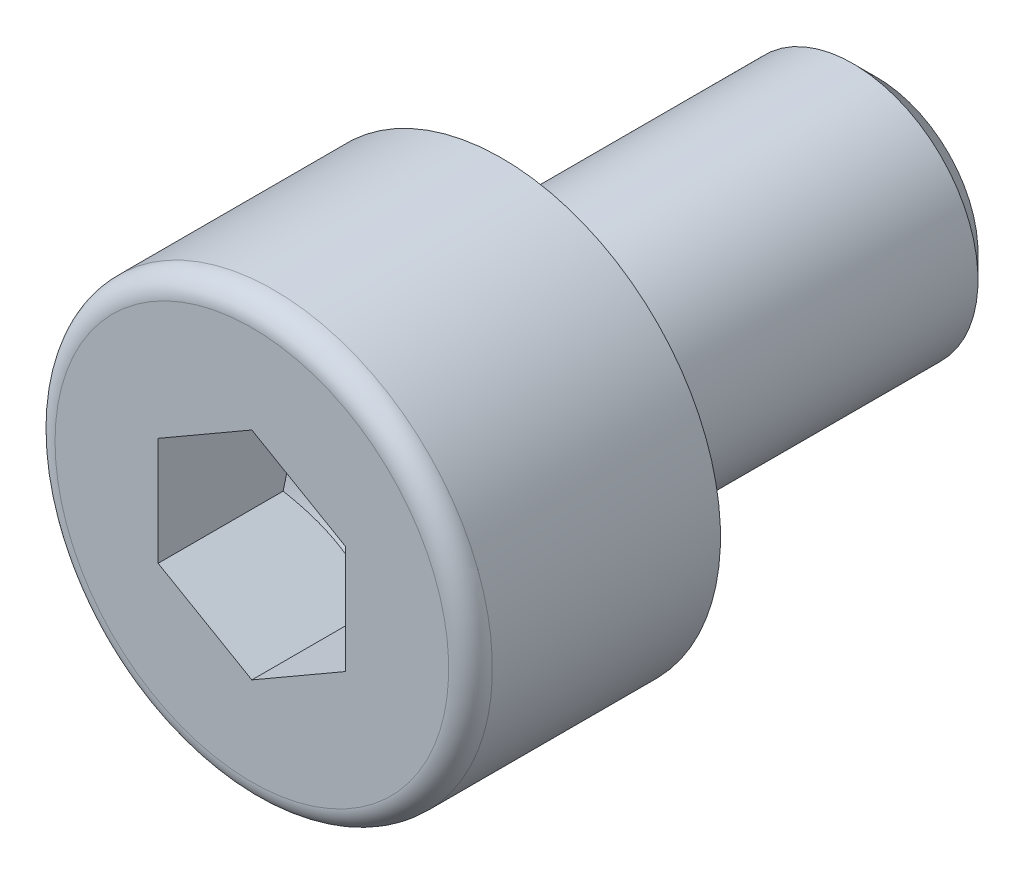
ISO-10303-21;
HEADER;
FILE_DESCRIPTION(('STEP AP214'),'2;1');
FILE_NAME('part.step','',(''),(''),'','','');
FILE_SCHEMA(('AUTOMOTIVE_DESIGN { 1 0 10303 214 1 1 1 1 }'));
ENDSEC;
DATA;
#1=APPLICATION_CONTEXT('core data for automotive mechanical design processes');
#2=APPLICATION_PROTOCOL_DEFINITION('international standard','automotive_design',2000,#1);
#3=PRODUCT_CONTEXT('',#1,'mechanical');
#4=PRODUCT('Part','Part','',(#3));
#5=PRODUCT_RELATED_PRODUCT_CATEGORY('part','',(#4));
#6=PRODUCT_DEFINITION_FORMATION('','',#4);
#7=PRODUCT_DEFINITION_CONTEXT('part definition',#1,'design');
#8=PRODUCT_DEFINITION('design','',#6,#7);
#9=PRODUCT_DEFINITION_SHAPE('','',#8);
#10=(LENGTH_UNIT() NAMED_UNIT(*) SI_UNIT(.MILLI.,.METRE.));
#11=(NAMED_UNIT(*) PLANE_ANGLE_UNIT() SI_UNIT($,.RADIAN.));
#12=(NAMED_UNIT(*) SI_UNIT($,.STERADIAN.) SOLID_ANGLE_UNIT());
#13=UNCERTAINTY_MEASURE_WITH_UNIT(LENGTH_MEASURE(1.E-05),#10,'distance_accuracy_value','');
#14=(GEOMETRIC_REPRESENTATION_CONTEXT(3) GLOBAL_UNCERTAINTY_ASSIGNED_CONTEXT((#13)) GLOBAL_UNIT_ASSIGNED_CONTEXT((#10,
#11,#12)) REPRESENTATION_CONTEXT('',''));
#15=CARTESIAN_POINT('',(0.,0.,0.));
#16=DIRECTION('',(0.,0.,1.));
#17=DIRECTION('',(1.,0.,0.));
#18=AXIS2_PLACEMENT_3D('',#15,#16,#17);
#19=CARTESIAN_POINT('',(-1.75,0.,0.));
#20=DIRECTION('',(0.,0.,-1.));
#21=DIRECTION('',(-1.,0.,0.));
#22=AXIS2_PLACEMENT_3D('',#19,#20,#21);
#23=PLANE('',#22);
#24=CARTESIAN_POINT('',(0.,0.,0.));
#25=DIRECTION('',(0.,0.,-1.));
#26=DIRECTION('',(-1.,0.,0.));
#27=AXIS2_PLACEMENT_3D('',#24,#25,#26);
#28=CIRCLE('',#27,3.5);
#29=CARTESIAN_POINT('',(-3.5,0.,0.));
#30=VERTEX_POINT('',#29);
#31=EDGE_CURVE('E11',#30,#30,#28,.T.);
#32=ORIENTED_EDGE('',*,*,#31,.T.);
#33=EDGE_LOOP('',(#32));
#34=FACE_BOUND('',#33,.T.);
#35=CARTESIAN_POINT('',(0.,0.,0.));
#36=DIRECTION('',(0.,0.,1.));
#37=DIRECTION('',(-1.,0.,0.));
#38=AXIS2_PLACEMENT_3D('',#35,#36,#37);
#39=CIRCLE('',#38,2.);
#40=CARTESIAN_POINT('',(2.,0.,0.));
#41=VERTEX_POINT('',#40);
#42=EDGE_CURVE('E67',#41,#41,#39,.T.);
#43=ORIENTED_EDGE('',*,*,#42,.T.);
#44=EDGE_LOOP('',(#43));
#45=FACE_BOUND('',#44,.T.);
#46=ADVANCED_FACE('F16',(#34,#45),#23,.T.);
#47=CARTESIAN_POINT('',(0.,0.,1.825));
#48=DIRECTION('',(0.,0.,1.));
#49=DIRECTION('',(-1.,0.,0.));
#50=AXIS2_PLACEMENT_3D('',#47,#48,#49);
#51=CYLINDRICAL_SURFACE('',#50,3.5);
#52=CARTESIAN_POINT('',(0.,0.,3.65));
#53=DIRECTION('',(0.,0.,-1.));
#54=DIRECTION('',(-1.,0.,0.));
#55=AXIS2_PLACEMENT_3D('',#52,#53,#54);
#56=CIRCLE('',#55,3.5);
#57=CARTESIAN_POINT('',(-3.5,0.,3.65));
#58=VERTEX_POINT('',#57);
#59=EDGE_CURVE('E26',#58,#58,#56,.T.);
#60=ORIENTED_EDGE('',*,*,#59,.T.);
#61=EDGE_LOOP('',(#60));
#62=FACE_BOUND('',#61,.T.);
#63=ORIENTED_EDGE('',*,*,#31,.F.);
#64=EDGE_LOOP('',(#63));
#65=FACE_BOUND('',#64,.T.);
#66=ADVANCED_FACE('F206',(#62,#65),#51,.T.);
#67=CARTESIAN_POINT('',(0.,0.,3.65));
#68=DIRECTION('',(0.,0.,-1.));
#69=DIRECTION('',(0.,-1.,0.));
#70=AXIS2_PLACEMENT_3D('',#67,#68,#69);
#71=TOROIDAL_SURFACE('',#70,3.15,0.35);
#72=CARTESIAN_POINT('',(0.,0.,4.));
#73=DIRECTION('',(0.,0.,-1.));
#74=DIRECTION('',(-1.,0.,0.));
#75=AXIS2_PLACEMENT_3D('',#72,#73,#74);
#76=CIRCLE('',#75,3.15);
#77=CARTESIAN_POINT('',(-3.15,0.,4.));
#78=VERTEX_POINT('',#77);
#79=EDGE_CURVE('E124',#78,#78,#76,.T.);
#80=ORIENTED_EDGE('',*,*,#79,.T.);
#81=EDGE_LOOP('',(#80));
#82=FACE_BOUND('',#81,.T.);
#83=ORIENTED_EDGE('',*,*,#59,.F.);
#84=EDGE_LOOP('',(#83));
#85=FACE_BOUND('',#84,.T.);
#86=ADVANCED_FACE('F210',(#82,#85),#71,.T.);
#87=CARTESIAN_POINT('',(-1.575,0.,4.));
#88=DIRECTION('',(0.,0.,1.));
#89=DIRECTION('',(1.,0.,0.));
#90=AXIS2_PLACEMENT_3D('',#87,#88,#89);
#91=PLANE('',#90);
#92=ORIENTED_EDGE('',*,*,#79,.F.);
#93=EDGE_LOOP('',(#92));
#94=FACE_BOUND('',#93,.T.);
#95=DIRECTION('',(-0.866025403784439,-0.5,0.));
#96=VECTOR('',#95,1.);
#97=CARTESIAN_POINT('',(0.159374650312418,-1.64003500274012,4.));
#98=LINE('',#97,#96);
#99=CARTESIAN_POINT('',(1.49999930062484,-0.866025,4.));
#100=VERTEX_POINT('',#99);
#101=CARTESIAN_POINT('',(0.,-1.73205,4.));
#102=VERTEX_POINT('',#101);
#103=EDGE_CURVE('E91',#100,#102,#98,.T.);
#104=ORIENTED_EDGE('',*,*,#103,.T.);
#105=DIRECTION('',(-0.866025403784439,0.5,0.));
#106=VECTOR('',#105,1.);
#107=CARTESIAN_POINT('',(-1.34062465031242,-0.958039997259878,4.));
#108=LINE('',#107,#106);
#109=CARTESIAN_POINT('',(-1.49999930062484,-0.866025,4.));
#110=VERTEX_POINT('',#109);
#111=EDGE_CURVE('E87',#102,#110,#108,.T.);
#112=ORIENTED_EDGE('',*,*,#111,.T.);
#113=DIRECTION('',(0.,1.,0.));
#114=VECTOR('',#113,1.);
#115=CARTESIAN_POINT('',(-1.49999930062484,0.,4.));
#116=LINE('',#115,#114);
#117=CARTESIAN_POINT('',(-1.49999930062484,0.866025,4.));
#118=VERTEX_POINT('',#117);
#119=EDGE_CURVE('E121',#110,#118,#116,.T.);
#120=ORIENTED_EDGE('',*,*,#119,.T.);
#121=DIRECTION('',(0.866025403784439,0.5,0.));
#122=VECTOR('',#121,1.);
#123=CARTESIAN_POINT('',(-1.34062465031242,0.958039997259878,4.));
#124=LINE('',#123,#122);
#125=CARTESIAN_POINT('',(0.,1.73205,4.));
#126=VERTEX_POINT('',#125);
#127=EDGE_CURVE('E122',#118,#126,#124,.T.);
#128=ORIENTED_EDGE('',*,*,#127,.T.);
#129=DIRECTION('',(0.866025403784439,-0.5,0.));
#130=VECTOR('',#129,1.);
#131=CARTESIAN_POINT('',(0.159374650312419,1.64003500274012,4.));
#132=LINE('',#131,#130);
#133=CARTESIAN_POINT('',(1.49999930062484,0.866025,4.));
#134=VERTEX_POINT('',#133);
#135=EDGE_CURVE('E136',#126,#134,#132,.T.);
#136=ORIENTED_EDGE('',*,*,#135,.T.);
#137=DIRECTION('',(0.,-1.,0.));
#138=VECTOR('',#137,1.);
#139=CARTESIAN_POINT('',(1.49999930062484,0.,4.));
#140=LINE('',#139,#138);
#141=EDGE_CURVE('E114',#134,#100,#140,.T.);
#142=ORIENTED_EDGE('',*,*,#141,.T.);
#143=EDGE_LOOP('',(#104,#112,#120,#128,#136,#142));
#144=FACE_BOUND('',#143,.T.);
#145=ADVANCED_FACE('F176',(#94,#144),#91,.T.);
#146=CARTESIAN_POINT('',(-0.8105625,0.,-6.));
#147=DIRECTION('',(0.,0.,-1.));
#148=DIRECTION('',(-1.,0.,0.));
#149=AXIS2_PLACEMENT_3D('',#146,#147,#148);
#150=PLANE('',#149);
#151=CARTESIAN_POINT('',(0.,0.,-6.));
#152=DIRECTION('',(0.,0.,-1.));
#153=DIRECTION('',(-1.,0.,0.));
#154=AXIS2_PLACEMENT_3D('',#151,#152,#153);
#155=CIRCLE('',#154,1.621125);
#156=CARTESIAN_POINT('',(-1.621125,0.,-6.));
#157=VERTEX_POINT('',#156);
#158=EDGE_CURVE('E59',#157,#157,#155,.T.);
#159=ORIENTED_EDGE('',*,*,#158,.T.);
#160=EDGE_LOOP('',(#159));
#161=FACE_BOUND('',#160,.T.);
#162=ADVANCED_FACE('F223',(#161),#150,.T.);
#163=CARTESIAN_POINT('',(0.,0.,-5.8105625));
#164=DIRECTION('',(0.,0.,1.));
#165=DIRECTION('',(-1.,0.,0.));
#166=AXIS2_PLACEMENT_3D('',#163,#164,#165);
#167=CONICAL_SURFACE('',#166,1.8105625,0.785398163397448);
#168=CARTESIAN_POINT('',(0.,0.,-5.621125));
#169=DIRECTION('',(0.,0.,-1.));
#170=DIRECTION('',(-1.,0.,0.));
#171=AXIS2_PLACEMENT_3D('',#168,#169,#170);
#172=CIRCLE('',#171,2.);
#173=CARTESIAN_POINT('',(-2.,0.,-5.621125));
#174=VERTEX_POINT('',#173);
#175=EDGE_CURVE('E131',#174,#174,#172,.T.);
#176=ORIENTED_EDGE('',*,*,#175,.T.);
#177=EDGE_LOOP('',(#176));
#178=FACE_BOUND('',#177,.T.);
#179=ORIENTED_EDGE('',*,*,#158,.F.);
#180=EDGE_LOOP('',(#179));
#181=FACE_BOUND('',#180,.T.);
#182=ADVANCED_FACE('F228',(#178,#181),#167,.T.);
#183=CARTESIAN_POINT('',(0.,0.,-2.3105625));
#184=DIRECTION('',(0.,0.,1.));
#185=DIRECTION('',(-1.,0.,0.));
#186=AXIS2_PLACEMENT_3D('',#183,#184,#185);
#187=CYLINDRICAL_SURFACE('',#186,2.);
#188=ORIENTED_EDGE('',*,*,#42,.F.);
#189=EDGE_LOOP('',(#188));
#190=FACE_BOUND('',#189,.T.);
#191=ORIENTED_EDGE('',*,*,#175,.F.);
#192=EDGE_LOOP('',(#191));
#193=FACE_BOUND('',#192,.T.);
#194=ADVANCED_FACE('F237',(#190,#193),#187,.T.);
#195=CARTESIAN_POINT('',(-0.749999650312418,-1.2990375,4.));
#196=DIRECTION('',(-0.5,-0.866025403784439,0.));
#197=DIRECTION('',(-0.866025403784439,0.5,0.));
#198=AXIS2_PLACEMENT_3D('',#195,#196,#197);
#199=PLANE('',#198);
#200=CARTESIAN_POINT('',(0.,-1.73205,2.));
#201=CARTESIAN_POINT('',(-0.749999650312417,-1.2990375,1.75000011656253));
#202=CARTESIAN_POINT('',(-1.49999930062484,-0.866025,2.));
#203=(BOUNDED_CURVE() B_SPLINE_CURVE(2,(#200,#201,#202),.UNSPECIFIED.,.F.,
.F.) B_SPLINE_CURVE_WITH_KNOTS((3,3),(0.,1.75265338994166),
.UNSPECIFIED.) CURVE() GEOMETRIC_REPRESENTATION_ITEM() RATIONAL_B_SPLINE_CURVE((1.,
1.15470053837925,1.)) REPRESENTATION_ITEM(''));
#204=CARTESIAN_POINT('',(0.,-1.73205,2.));
#205=VERTEX_POINT('',#204);
#206=CARTESIAN_POINT('',(-1.49999930062484,-0.866025,2.));
#207=VERTEX_POINT('',#206);
#208=EDGE_CURVE('E84',#205,#207,#203,.T.);
#209=ORIENTED_EDGE('',*,*,#208,.T.);
#210=DIRECTION('',(0.,0.,-1.));
#211=VECTOR('',#210,1.);
#212=CARTESIAN_POINT('',(-1.49999930062484,-0.866025,4.));
#213=LINE('',#212,#211);
#214=EDGE_CURVE('E127',#110,#207,#213,.T.);
#215=ORIENTED_EDGE('',*,*,#214,.F.);
#216=ORIENTED_EDGE('',*,*,#111,.F.);
#217=DIRECTION('',(0.,0.,-1.));
#218=VECTOR('',#217,1.);
#219=CARTESIAN_POINT('',(0.,-1.73205,4.));
#220=LINE('',#219,#218);
#221=EDGE_CURVE('E20',#102,#205,#220,.T.);
#222=ORIENTED_EDGE('',*,*,#221,.T.);
#223=EDGE_LOOP('',(#209,#215,#216,#222));
#224=FACE_BOUND('',#223,.T.);
#225=ADVANCED_FACE('F81',(#224),#199,.F.);
#226=CARTESIAN_POINT('',(-1.49999930062484,0.,4.));
#227=DIRECTION('',(-1.,0.,0.));
#228=DIRECTION('',(0.,1.,0.));
#229=AXIS2_PLACEMENT_3D('',#226,#227,#228);
#230=PLANE('',#229);
#231=CARTESIAN_POINT('',(-1.49999930062484,-0.866025,2.));
#232=CARTESIAN_POINT('',(-1.49999930062483,0.,1.75000011656253));
#233=CARTESIAN_POINT('',(-1.49999930062484,0.866025,2.));
#234=(BOUNDED_CURVE() B_SPLINE_CURVE(2,(#231,#232,#233),.UNSPECIFIED.,.F.,
.F.) B_SPLINE_CURVE_WITH_KNOTS((3,3),(0.,1.75265338994166),
.UNSPECIFIED.) CURVE() GEOMETRIC_REPRESENTATION_ITEM() RATIONAL_B_SPLINE_CURVE((1.,
1.15470053837925,1.)) REPRESENTATION_ITEM(''));
#235=CARTESIAN_POINT('',(-1.49999930062484,0.866025,2.));
#236=VERTEX_POINT('',#235);
#237=EDGE_CURVE('E106',#207,#236,#234,.T.);
#238=ORIENTED_EDGE('',*,*,#237,.T.);
#239=DIRECTION('',(0.,0.,-1.));
#240=VECTOR('',#239,1.);
#241=CARTESIAN_POINT('',(-1.49999930062484,0.866025,4.));
#242=LINE('',#241,#240);
#243=EDGE_CURVE('E119',#118,#236,#242,.T.);
#244=ORIENTED_EDGE('',*,*,#243,.F.);
#245=ORIENTED_EDGE('',*,*,#119,.F.);
#246=ORIENTED_EDGE('',*,*,#214,.T.);
#247=EDGE_LOOP('',(#238,#244,#245,#246));
#248=FACE_BOUND('',#247,.T.);
#249=ADVANCED_FACE('F217',(#248),#230,.F.);
#250=CARTESIAN_POINT('',(-0.749999650312418,1.2990375,4.));
#251=DIRECTION('',(-0.5,0.866025403784439,0.));
#252=DIRECTION('',(0.866025403784439,0.5,0.));
#253=AXIS2_PLACEMENT_3D('',#250,#251,#252);
#254=PLANE('',#253);
#255=CARTESIAN_POINT('',(-1.49999930062484,0.866025,2.));
#256=CARTESIAN_POINT('',(-0.749999650312418,1.2990375,1.75000011656253));
#257=CARTESIAN_POINT('',(0.,1.73205,2.));
#258=(BOUNDED_CURVE() B_SPLINE_CURVE(2,(#255,#256,#257),.UNSPECIFIED.,.F.,
.F.) B_SPLINE_CURVE_WITH_KNOTS((3,3),(0.,1.75265338994166),
.UNSPECIFIED.) CURVE() GEOMETRIC_REPRESENTATION_ITEM() RATIONAL_B_SPLINE_CURVE((1.,
1.15470053837925,1.)) REPRESENTATION_ITEM(''));
#259=CARTESIAN_POINT('',(0.,1.73205,2.));
#260=VERTEX_POINT('',#259);
#261=EDGE_CURVE('E108',#236,#260,#258,.T.);
#262=ORIENTED_EDGE('',*,*,#261,.T.);
#263=DIRECTION('',(0.,0.,-1.));
#264=VECTOR('',#263,1.);
#265=CARTESIAN_POINT('',(0.,1.73205,4.));
#266=LINE('',#265,#264);
#267=EDGE_CURVE('E139',#126,#260,#266,.T.);
#268=ORIENTED_EDGE('',*,*,#267,.F.);
#269=ORIENTED_EDGE('',*,*,#127,.F.);
#270=ORIENTED_EDGE('',*,*,#243,.T.);
#271=EDGE_LOOP('',(#262,#268,#269,#270));
#272=FACE_BOUND('',#271,.T.);
#273=ADVANCED_FACE('F185',(#272),#254,.F.);
#274=CARTESIAN_POINT('',(0.749999650312419,1.2990375,4.));
#275=DIRECTION('',(0.5,0.866025403784439,0.));
#276=DIRECTION('',(0.866025403784439,-0.5,0.));
#277=AXIS2_PLACEMENT_3D('',#274,#275,#276);
#278=PLANE('',#277);
#279=CARTESIAN_POINT('',(0.,1.73205,2.));
#280=CARTESIAN_POINT('',(0.749999650312419,1.2990375,1.75000011656253));
#281=CARTESIAN_POINT('',(1.49999930062484,0.866025,2.));
#282=(BOUNDED_CURVE() B_SPLINE_CURVE(2,(#279,#280,#281),.UNSPECIFIED.,.F.,
.F.) B_SPLINE_CURVE_WITH_KNOTS((3,3),(0.,1.75265338994166),
.UNSPECIFIED.) CURVE() GEOMETRIC_REPRESENTATION_ITEM() RATIONAL_B_SPLINE_CURVE((1.,
1.15470053837925,1.)) REPRESENTATION_ITEM(''));
#283=CARTESIAN_POINT('',(1.49999930062484,0.866025,2.));
#284=VERTEX_POINT('',#283);
#285=EDGE_CURVE('E92',#260,#284,#282,.T.);
#286=ORIENTED_EDGE('',*,*,#285,.T.);
#287=DIRECTION('',(0.,0.,-1.));
#288=VECTOR('',#287,1.);
#289=CARTESIAN_POINT('',(1.49999930062484,0.866025,4.));
#290=LINE('',#289,#288);
#291=EDGE_CURVE('E140',#134,#284,#290,.T.);
#292=ORIENTED_EDGE('',*,*,#291,.F.);
#293=ORIENTED_EDGE('',*,*,#135,.F.);
#294=ORIENTED_EDGE('',*,*,#267,.T.);
#295=EDGE_LOOP('',(#286,#292,#293,#294));
#296=FACE_BOUND('',#295,.T.);
#297=ADVANCED_FACE('F18',(#296),#278,.F.);
#298=CARTESIAN_POINT('',(1.49999930062484,0.,4.));
#299=DIRECTION('',(1.,0.,0.));
#300=DIRECTION('',(0.,-1.,0.));
#301=AXIS2_PLACEMENT_3D('',#298,#299,#300);
#302=PLANE('',#301);
#303=CARTESIAN_POINT('',(1.49999930062484,0.866025,2.));
#304=CARTESIAN_POINT('',(1.49999930062485,0.,1.75000011656253));
#305=CARTESIAN_POINT('',(1.49999930062484,-0.866025,2.));
#306=(BOUNDED_CURVE() B_SPLINE_CURVE(2,(#303,#304,#305),.UNSPECIFIED.,.F.,
.F.) B_SPLINE_CURVE_WITH_KNOTS((3,3),(0.,1.75265338994166),
.UNSPECIFIED.) CURVE() GEOMETRIC_REPRESENTATION_ITEM() RATIONAL_B_SPLINE_CURVE((1.,
1.15470053837924,1.)) REPRESENTATION_ITEM(''));
#307=CARTESIAN_POINT('',(1.49999930062484,-0.866025,2.));
#308=VERTEX_POINT('',#307);
#309=EDGE_CURVE('E101',#284,#308,#306,.T.);
#310=ORIENTED_EDGE('',*,*,#309,.T.);
#311=DIRECTION('',(0.,0.,-1.));
#312=VECTOR('',#311,1.);
#313=CARTESIAN_POINT('',(1.49999930062484,-0.866025,4.));
#314=LINE('',#313,#312);
#315=EDGE_CURVE('E97',#100,#308,#314,.T.);
#316=ORIENTED_EDGE('',*,*,#315,.F.);
#317=ORIENTED_EDGE('',*,*,#141,.F.);
#318=ORIENTED_EDGE('',*,*,#291,.T.);
#319=EDGE_LOOP('',(#310,#316,#317,#318));
#320=FACE_BOUND('',#319,.T.);
#321=ADVANCED_FACE('F191',(#320),#302,.F.);
#322=CARTESIAN_POINT('',(0.749999650312418,-1.2990375,4.));
#323=DIRECTION('',(0.5,-0.866025403784439,0.));
#324=DIRECTION('',(-0.866025403784439,-0.5,0.));
#325=AXIS2_PLACEMENT_3D('',#322,#323,#324);
#326=PLANE('',#325);
#327=CARTESIAN_POINT('',(1.49999930062484,-0.866025,2.));
#328=CARTESIAN_POINT('',(0.749999650312423,-1.2990375,1.75000011656253));
#329=CARTESIAN_POINT('',(0.,-1.73205,2.));
#330=(BOUNDED_CURVE() B_SPLINE_CURVE(2,(#327,#328,#329),.UNSPECIFIED.,.F.,
.F.) B_SPLINE_CURVE_WITH_KNOTS((3,3),(0.,1.75265338994166),
.UNSPECIFIED.) CURVE() GEOMETRIC_REPRESENTATION_ITEM() RATIONAL_B_SPLINE_CURVE((1.,
1.15470053837924,1.)) REPRESENTATION_ITEM(''));
#331=EDGE_CURVE('E94',#308,#205,#330,.T.);
#332=ORIENTED_EDGE('',*,*,#331,.T.);
#333=ORIENTED_EDGE('',*,*,#221,.F.);
#334=ORIENTED_EDGE('',*,*,#103,.F.);
#335=ORIENTED_EDGE('',*,*,#315,.T.);
#336=EDGE_LOOP('',(#332,#333,#334,#335));
#337=FACE_BOUND('',#336,.T.);
#338=ADVANCED_FACE('F95',(#337),#326,.F.);
#339=CARTESIAN_POINT('',(0.,0.,1.50000023312505));
#340=DIRECTION('',(0.,0.,1.));
#341=DIRECTION('',(-1.,0.,0.));
#342=AXIS2_PLACEMENT_3D('',#339,#340,#341);
#343=CONICAL_SURFACE('',#342,0.866025,1.0471975511966);
#344=CARTESIAN_POINT('',(0.,0.,1.00000046625011));
#345=VERTEX_POINT('',#344);
#346=VERTEX_LOOP('',#345);
#347=FACE_BOUND('',#346,.T.);
#348=ORIENTED_EDGE('',*,*,#261,.F.);
#349=ORIENTED_EDGE('',*,*,#237,.F.);
#350=ORIENTED_EDGE('',*,*,#208,.F.);
#351=ORIENTED_EDGE('',*,*,#331,.F.);
#352=ORIENTED_EDGE('',*,*,#309,.F.);
#353=ORIENTED_EDGE('',*,*,#285,.F.);
#354=EDGE_LOOP('',(#348,#349,#350,#351,#352,#353));
#355=FACE_BOUND('',#354,.T.);
#356=ADVANCED_FACE('F104',(#347,#355),#343,.F.);
#357=CLOSED_SHELL('',(#46,#66,#86,#145,#162,#182,#194,#225,#249,#273,#297,#321,#338,#356));
#358=MANIFOLD_SOLID_BREP('B1',#357);
#359=ADVANCED_BREP_SHAPE_REPRESENTATION('',(#18,#358),#14);
#360=SHAPE_DEFINITION_REPRESENTATION(#9,#359);
ENDSEC;
END-ISO-10303-21;
